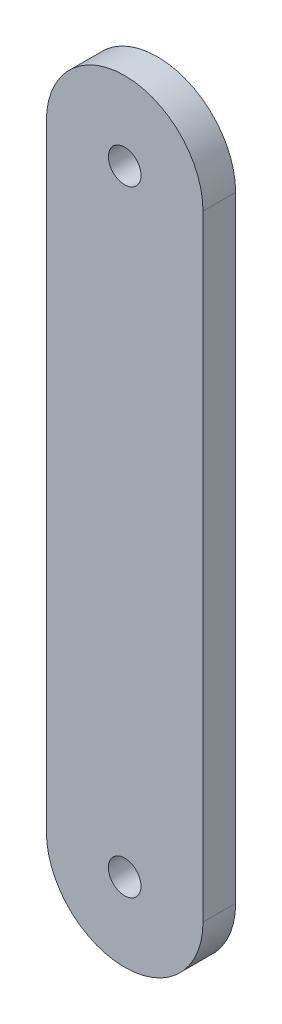
ISO-10303-21;
HEADER;
FILE_DESCRIPTION(('STEP AP214'),'2;1');
FILE_NAME('part.step','',(''),(''),'','','');
FILE_SCHEMA(('AUTOMOTIVE_DESIGN { 1 0 10303 214 1 1 1 1 }'));
ENDSEC;
DATA;
#1=APPLICATION_CONTEXT('core data for automotive mechanical design processes');
#2=APPLICATION_PROTOCOL_DEFINITION('international standard','automotive_design',2000,#1);
#3=PRODUCT_CONTEXT('',#1,'mechanical');
#4=PRODUCT('Part','Part','',(#3));
#5=PRODUCT_RELATED_PRODUCT_CATEGORY('part','',(#4));
#6=PRODUCT_DEFINITION_FORMATION('','',#4);
#7=PRODUCT_DEFINITION_CONTEXT('part definition',#1,'design');
#8=PRODUCT_DEFINITION('design','',#6,#7);
#9=PRODUCT_DEFINITION_SHAPE('','',#8);
#10=(LENGTH_UNIT() NAMED_UNIT(*) SI_UNIT(.MILLI.,.METRE.));
#11=(NAMED_UNIT(*) PLANE_ANGLE_UNIT() SI_UNIT($,.RADIAN.));
#12=(NAMED_UNIT(*) SI_UNIT($,.STERADIAN.) SOLID_ANGLE_UNIT());
#13=UNCERTAINTY_MEASURE_WITH_UNIT(LENGTH_MEASURE(1.E-05),#10,'distance_accuracy_value','');
#14=(GEOMETRIC_REPRESENTATION_CONTEXT(3) GLOBAL_UNCERTAINTY_ASSIGNED_CONTEXT((#13)) GLOBAL_UNIT_ASSIGNED_CONTEXT((#10,
#11,#12)) REPRESENTATION_CONTEXT('',''));
#15=CARTESIAN_POINT('',(0.,0.,0.));
#16=DIRECTION('',(0.,0.,1.));
#17=DIRECTION('',(1.,0.,0.));
#18=AXIS2_PLACEMENT_3D('',#15,#16,#17);
#19=CARTESIAN_POINT('',(0.,-47.1600000000001,0.));
#20=DIRECTION('',(0.,0.,1.));
#21=DIRECTION('',(1.,0.,0.));
#22=AXIS2_PLACEMENT_3D('',#19,#20,#21);
#23=CYLINDRICAL_SURFACE('',#22,12.);
#24=CARTESIAN_POINT('',(0.,-47.1600000000001,5.));
#25=DIRECTION('',(0.,0.,1.));
#26=DIRECTION('',(1.,0.,0.));
#27=AXIS2_PLACEMENT_3D('',#24,#25,#26);
#28=CIRCLE('',#27,12.);
#29=CARTESIAN_POINT('',(-12.,-47.1600000000001,5.));
#30=VERTEX_POINT('',#29);
#31=CARTESIAN_POINT('',(12.,-47.1600000000001,5.));
#32=VERTEX_POINT('',#31);
#33=EDGE_CURVE('E101',#30,#32,#28,.T.);
#34=ORIENTED_EDGE('',*,*,#33,.F.);
#35=DIRECTION('',(0.,0.,1.));
#36=VECTOR('',#35,1.);
#37=CARTESIAN_POINT('',(-12.,-47.1600000000001,0.));
#38=LINE('',#37,#36);
#39=CARTESIAN_POINT('',(-12.,-47.1600000000001,0.));
#40=VERTEX_POINT('',#39);
#41=EDGE_CURVE('E11',#40,#30,#38,.T.);
#42=ORIENTED_EDGE('',*,*,#41,.F.);
#43=CARTESIAN_POINT('',(0.,-47.1600000000001,0.));
#44=DIRECTION('',(0.,0.,1.));
#45=DIRECTION('',(1.,0.,0.));
#46=AXIS2_PLACEMENT_3D('',#43,#44,#45);
#47=CIRCLE('',#46,12.);
#48=CARTESIAN_POINT('',(12.,-47.1600000000001,0.));
#49=VERTEX_POINT('',#48);
#50=EDGE_CURVE('E94',#40,#49,#47,.T.);
#51=ORIENTED_EDGE('',*,*,#50,.T.);
#52=DIRECTION('',(0.,0.,1.));
#53=VECTOR('',#52,1.);
#54=CARTESIAN_POINT('',(12.,-47.1600000000001,0.));
#55=LINE('',#54,#53);
#56=EDGE_CURVE('E39',#49,#32,#55,.T.);
#57=ORIENTED_EDGE('',*,*,#56,.T.);
#58=EDGE_LOOP('',(#34,#42,#51,#57));
#59=FACE_BOUND('',#58,.T.);
#60=ADVANCED_FACE('F36',(#59),#23,.T.);
#61=CARTESIAN_POINT('',(-12.,47.1600000000001,0.));
#62=DIRECTION('',(-1.,0.,0.));
#63=DIRECTION('',(0.,0.,1.));
#64=AXIS2_PLACEMENT_3D('',#61,#62,#63);
#65=PLANE('',#64);
#66=DIRECTION('',(0.,-1.,0.));
#67=VECTOR('',#66,1.);
#68=CARTESIAN_POINT('',(-12.,47.1600000000001,5.));
#69=LINE('',#68,#67);
#70=CARTESIAN_POINT('',(-12.,47.1600000000001,5.));
#71=VERTEX_POINT('',#70);
#72=EDGE_CURVE('E96',#71,#30,#69,.T.);
#73=ORIENTED_EDGE('',*,*,#72,.F.);
#74=DIRECTION('',(0.,0.,1.));
#75=VECTOR('',#74,1.);
#76=CARTESIAN_POINT('',(-12.,47.1600000000001,0.));
#77=LINE('',#76,#75);
#78=CARTESIAN_POINT('',(-12.,47.1600000000001,0.));
#79=VERTEX_POINT('',#78);
#80=EDGE_CURVE('E45',#79,#71,#77,.T.);
#81=ORIENTED_EDGE('',*,*,#80,.F.);
#82=DIRECTION('',(0.,-1.,0.));
#83=VECTOR('',#82,1.);
#84=CARTESIAN_POINT('',(-12.,47.1600000000001,0.));
#85=LINE('',#84,#83);
#86=EDGE_CURVE('E91',#79,#40,#85,.T.);
#87=ORIENTED_EDGE('',*,*,#86,.T.);
#88=ORIENTED_EDGE('',*,*,#41,.T.);
#89=EDGE_LOOP('',(#73,#81,#87,#88));
#90=FACE_BOUND('',#89,.T.);
#91=ADVANCED_FACE('F112',(#90),#65,.T.);
#92=CARTESIAN_POINT('',(0.,47.1600000000001,0.));
#93=DIRECTION('',(0.,0.,1.));
#94=DIRECTION('',(1.,0.,0.));
#95=AXIS2_PLACEMENT_3D('',#92,#93,#94);
#96=CYLINDRICAL_SURFACE('',#95,12.);
#97=CARTESIAN_POINT('',(0.,47.1600000000001,5.));
#98=DIRECTION('',(0.,0.,1.));
#99=DIRECTION('',(1.,0.,0.));
#100=AXIS2_PLACEMENT_3D('',#97,#98,#99);
#101=CIRCLE('',#100,12.);
#102=CARTESIAN_POINT('',(12.,47.1600000000001,5.));
#103=VERTEX_POINT('',#102);
#104=EDGE_CURVE('E86',#103,#71,#101,.T.);
#105=ORIENTED_EDGE('',*,*,#104,.F.);
#106=DIRECTION('',(0.,0.,1.));
#107=VECTOR('',#106,1.);
#108=CARTESIAN_POINT('',(12.,47.1600000000001,0.));
#109=LINE('',#108,#107);
#110=CARTESIAN_POINT('',(12.,47.1600000000001,0.));
#111=VERTEX_POINT('',#110);
#112=EDGE_CURVE('E81',#111,#103,#109,.T.);
#113=ORIENTED_EDGE('',*,*,#112,.F.);
#114=CARTESIAN_POINT('',(0.,47.1600000000001,0.));
#115=DIRECTION('',(0.,0.,1.));
#116=DIRECTION('',(1.,0.,0.));
#117=AXIS2_PLACEMENT_3D('',#114,#115,#116);
#118=CIRCLE('',#117,12.);
#119=EDGE_CURVE('E84',#111,#79,#118,.T.);
#120=ORIENTED_EDGE('',*,*,#119,.T.);
#121=ORIENTED_EDGE('',*,*,#80,.T.);
#122=EDGE_LOOP('',(#105,#113,#120,#121));
#123=FACE_BOUND('',#122,.T.);
#124=ADVANCED_FACE('F83',(#123),#96,.T.);
#125=CARTESIAN_POINT('',(12.,-47.1600000000001,0.));
#126=DIRECTION('',(1.,0.,0.));
#127=DIRECTION('',(0.,1.,0.));
#128=AXIS2_PLACEMENT_3D('',#125,#126,#127);
#129=PLANE('',#128);
#130=DIRECTION('',(0.,1.,0.));
#131=VECTOR('',#130,1.);
#132=CARTESIAN_POINT('',(12.,-47.1600000000001,5.));
#133=LINE('',#132,#131);
#134=EDGE_CURVE('E104',#32,#103,#133,.T.);
#135=ORIENTED_EDGE('',*,*,#134,.F.);
#136=ORIENTED_EDGE('',*,*,#56,.F.);
#137=DIRECTION('',(0.,1.,0.));
#138=VECTOR('',#137,1.);
#139=CARTESIAN_POINT('',(12.,-47.1600000000001,0.));
#140=LINE('',#139,#138);
#141=EDGE_CURVE('E90',#49,#111,#140,.T.);
#142=ORIENTED_EDGE('',*,*,#141,.T.);
#143=ORIENTED_EDGE('',*,*,#112,.T.);
#144=EDGE_LOOP('',(#135,#136,#142,#143));
#145=FACE_BOUND('',#144,.T.);
#146=ADVANCED_FACE('F93',(#145),#129,.T.);
#147=CARTESIAN_POINT('',(0.,-47.1600000000001,0.));
#148=DIRECTION('',(0.,0.,1.));
#149=DIRECTION('',(1.,0.,0.));
#150=AXIS2_PLACEMENT_3D('',#147,#148,#149);
#151=PLANE('',#150);
#152=CARTESIAN_POINT('',(0.,47.1600000000001,0.));
#153=DIRECTION('',(0.,0.,1.));
#154=DIRECTION('',(-1.,0.,0.));
#155=AXIS2_PLACEMENT_3D('',#152,#153,#154);
#156=CIRCLE('',#155,2.5);
#157=CARTESIAN_POINT('',(-2.5,47.1600000000001,0.));
#158=VERTEX_POINT('',#157);
#159=EDGE_CURVE('E145',#158,#158,#156,.T.);
#160=ORIENTED_EDGE('',*,*,#159,.T.);
#161=EDGE_LOOP('',(#160));
#162=FACE_BOUND('',#161,.T.);
#163=CARTESIAN_POINT('',(0.,-47.1600000000001,0.));
#164=DIRECTION('',(0.,0.,1.));
#165=DIRECTION('',(-1.,0.,0.));
#166=AXIS2_PLACEMENT_3D('',#163,#164,#165);
#167=CIRCLE('',#166,2.5);
#168=CARTESIAN_POINT('',(-2.5,-47.1600000000001,0.));
#169=VERTEX_POINT('',#168);
#170=EDGE_CURVE('E105',#169,#169,#167,.T.);
#171=ORIENTED_EDGE('',*,*,#170,.T.);
#172=EDGE_LOOP('',(#171));
#173=FACE_BOUND('',#172,.T.);
#174=ORIENTED_EDGE('',*,*,#50,.F.);
#175=ORIENTED_EDGE('',*,*,#86,.F.);
#176=ORIENTED_EDGE('',*,*,#119,.F.);
#177=ORIENTED_EDGE('',*,*,#141,.F.);
#178=EDGE_LOOP('',(#174,#175,#176,#177));
#179=FACE_BOUND('',#178,.T.);
#180=ADVANCED_FACE('F89',(#162,#173,#179),#151,.F.);
#181=CARTESIAN_POINT('',(0.,-47.1600000000001,5.));
#182=DIRECTION('',(0.,0.,1.));
#183=DIRECTION('',(1.,0.,0.));
#184=AXIS2_PLACEMENT_3D('',#181,#182,#183);
#185=PLANE('',#184);
#186=CARTESIAN_POINT('',(0.,47.1600000000001,5.));
#187=DIRECTION('',(0.,0.,1.));
#188=DIRECTION('',(-1.,0.,0.));
#189=AXIS2_PLACEMENT_3D('',#186,#187,#188);
#190=CIRCLE('',#189,2.5);
#191=CARTESIAN_POINT('',(-2.5,47.1600000000001,5.));
#192=VERTEX_POINT('',#191);
#193=EDGE_CURVE('E148',#192,#192,#190,.T.);
#194=ORIENTED_EDGE('',*,*,#193,.F.);
#195=EDGE_LOOP('',(#194));
#196=FACE_BOUND('',#195,.T.);
#197=CARTESIAN_POINT('',(0.,-47.1600000000001,5.));
#198=DIRECTION('',(0.,0.,1.));
#199=DIRECTION('',(-1.,0.,0.));
#200=AXIS2_PLACEMENT_3D('',#197,#198,#199);
#201=CIRCLE('',#200,2.5);
#202=CARTESIAN_POINT('',(-2.5,-47.1600000000001,5.));
#203=VERTEX_POINT('',#202);
#204=EDGE_CURVE('E150',#203,#203,#201,.T.);
#205=ORIENTED_EDGE('',*,*,#204,.F.);
#206=EDGE_LOOP('',(#205));
#207=FACE_BOUND('',#206,.T.);
#208=ORIENTED_EDGE('',*,*,#33,.T.);
#209=ORIENTED_EDGE('',*,*,#134,.T.);
#210=ORIENTED_EDGE('',*,*,#104,.T.);
#211=ORIENTED_EDGE('',*,*,#72,.T.);
#212=EDGE_LOOP('',(#208,#209,#210,#211));
#213=FACE_BOUND('',#212,.T.);
#214=ADVANCED_FACE('F111',(#196,#207,#213),#185,.T.);
#215=CARTESIAN_POINT('',(0.,-47.1600000000001,0.));
#216=DIRECTION('',(0.,0.,1.));
#217=DIRECTION('',(1.,0.,0.));
#218=AXIS2_PLACEMENT_3D('',#215,#216,#217);
#219=CYLINDRICAL_SURFACE('',#218,2.5);
#220=ORIENTED_EDGE('',*,*,#170,.F.);
#221=EDGE_LOOP('',(#220));
#222=FACE_BOUND('',#221,.T.);
#223=ORIENTED_EDGE('',*,*,#204,.T.);
#224=EDGE_LOOP('',(#223));
#225=FACE_BOUND('',#224,.T.);
#226=ADVANCED_FACE('F130',(#222,#225),#219,.F.);
#227=CARTESIAN_POINT('',(0.,47.1600000000001,0.));
#228=DIRECTION('',(0.,0.,1.));
#229=DIRECTION('',(1.,0.,0.));
#230=AXIS2_PLACEMENT_3D('',#227,#228,#229);
#231=CYLINDRICAL_SURFACE('',#230,2.5);
#232=ORIENTED_EDGE('',*,*,#159,.F.);
#233=EDGE_LOOP('',(#232));
#234=FACE_BOUND('',#233,.T.);
#235=ORIENTED_EDGE('',*,*,#193,.T.);
#236=EDGE_LOOP('',(#235));
#237=FACE_BOUND('',#236,.T.);
#238=ADVANCED_FACE('F137',(#234,#237),#231,.F.);
#239=CLOSED_SHELL('',(#60,#91,#124,#146,#180,#214,#226,#238));
#240=MANIFOLD_SOLID_BREP('B2',#239);
#241=ADVANCED_BREP_SHAPE_REPRESENTATION('',(#18,#240),#14);
#242=SHAPE_DEFINITION_REPRESENTATION(#9,#241);
ENDSEC;
END-ISO-10303-21;
